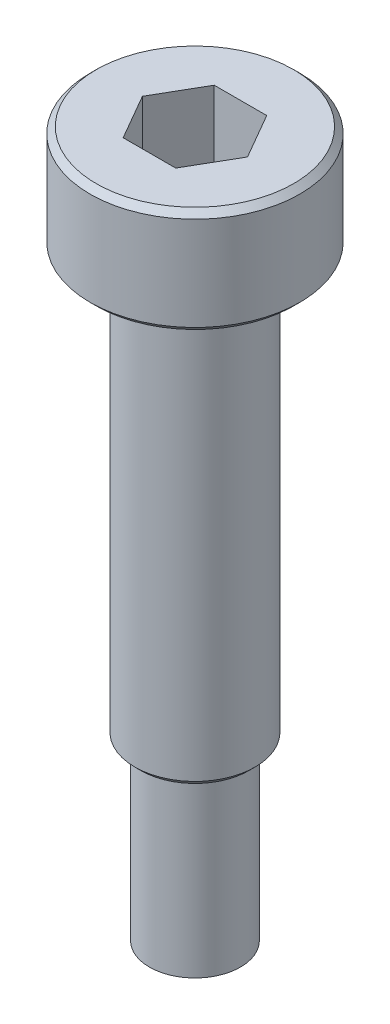
ISO-10303-21;
HEADER;
FILE_DESCRIPTION(('STEP AP214'),'2;1');
FILE_NAME('part.step','',(''),(''),'','','');
FILE_SCHEMA(('AUTOMOTIVE_DESIGN { 1 0 10303 214 1 1 1 1 }'));
ENDSEC;
DATA;
#1=APPLICATION_CONTEXT('core data for automotive mechanical design processes');
#2=APPLICATION_PROTOCOL_DEFINITION('international standard','automotive_design',2000,#1);
#3=PRODUCT_CONTEXT('',#1,'mechanical');
#4=PRODUCT('Part','Part','',(#3));
#5=PRODUCT_RELATED_PRODUCT_CATEGORY('part','',(#4));
#6=PRODUCT_DEFINITION_FORMATION('','',#4);
#7=PRODUCT_DEFINITION_CONTEXT('part definition',#1,'design');
#8=PRODUCT_DEFINITION('design','',#6,#7);
#9=PRODUCT_DEFINITION_SHAPE('','',#8);
#10=(LENGTH_UNIT() NAMED_UNIT(*) SI_UNIT(.MILLI.,.METRE.));
#11=(NAMED_UNIT(*) PLANE_ANGLE_UNIT() SI_UNIT($,.RADIAN.));
#12=(NAMED_UNIT(*) SI_UNIT($,.STERADIAN.) SOLID_ANGLE_UNIT());
#13=UNCERTAINTY_MEASURE_WITH_UNIT(LENGTH_MEASURE(1.E-05),#10,'distance_accuracy_value','');
#14=(GEOMETRIC_REPRESENTATION_CONTEXT(3) GLOBAL_UNCERTAINTY_ASSIGNED_CONTEXT((#13)) GLOBAL_UNIT_ASSIGNED_CONTEXT((#10,
#11,#12)) REPRESENTATION_CONTEXT('',''));
#15=CARTESIAN_POINT('',(0.,0.,0.));
#16=DIRECTION('',(0.,0.,1.));
#17=DIRECTION('',(1.,0.,0.));
#18=AXIS2_PLACEMENT_3D('',#15,#16,#17);
#19=CARTESIAN_POINT('',(0.,0.,0.));
#20=DIRECTION('',(0.,1.,0.));
#21=DIRECTION('',(0.,0.,1.));
#22=AXIS2_PLACEMENT_3D('',#19,#20,#21);
#23=PLANE('',#22);
#24=CARTESIAN_POINT('',(0.,0.,0.));
#25=DIRECTION('',(0.,1.,0.));
#26=DIRECTION('',(0.,0.,1.));
#27=AXIS2_PLACEMENT_3D('',#24,#25,#26);
#28=CIRCLE('',#27,1.5);
#29=CARTESIAN_POINT('',(0.,0.,1.5));
#30=VERTEX_POINT('',#29);
#31=EDGE_CURVE('E160',#30,#30,#28,.T.);
#32=ORIENTED_EDGE('',*,*,#31,.F.);
#33=EDGE_LOOP('',(#32));
#34=FACE_BOUND('',#33,.T.);
#35=ADVANCED_FACE('F46',(#34),#23,.F.);
#36=CARTESIAN_POINT('',(0.,23.24,0.));
#37=DIRECTION('',(0.,1.,0.));
#38=DIRECTION('',(0.,0.,1.));
#39=AXIS2_PLACEMENT_3D('',#36,#37,#38);
#40=CYLINDRICAL_SURFACE('',#39,1.5);
#41=CARTESIAN_POINT('',(0.,5.75,0.));
#42=DIRECTION('',(0.,1.,0.));
#43=DIRECTION('',(0.,0.,1.));
#44=AXIS2_PLACEMENT_3D('',#41,#42,#43);
#45=CIRCLE('',#44,1.5);
#46=CARTESIAN_POINT('',(0.,5.75,1.5));
#47=VERTEX_POINT('',#46);
#48=EDGE_CURVE('E157',#47,#47,#45,.T.);
#49=ORIENTED_EDGE('',*,*,#48,.F.);
#50=EDGE_LOOP('',(#49));
#51=FACE_BOUND('',#50,.T.);
#52=ORIENTED_EDGE('',*,*,#31,.T.);
#53=EDGE_LOOP('',(#52));
#54=FACE_BOUND('',#53,.T.);
#55=ADVANCED_FACE('F216',(#51,#54),#40,.T.);
#56=CARTESIAN_POINT('',(1.5,5.75,0.));
#57=DIRECTION('',(0.,1.,0.));
#58=DIRECTION('',(0.,0.,1.));
#59=AXIS2_PLACEMENT_3D('',#56,#57,#58);
#60=PLANE('',#59);
#61=CARTESIAN_POINT('',(0.,5.75,0.));
#62=DIRECTION('',(0.,1.,0.));
#63=DIRECTION('',(0.,0.,1.));
#64=AXIS2_PLACEMENT_3D('',#61,#62,#63);
#65=CIRCLE('',#64,1.77999999999999);
#66=CARTESIAN_POINT('',(0.,5.75,1.77999999999999));
#67=VERTEX_POINT('',#66);
#68=EDGE_CURVE('E166',#67,#67,#65,.F.);
#69=ORIENTED_EDGE('',*,*,#68,.T.);
#70=EDGE_LOOP('',(#69));
#71=FACE_BOUND('',#70,.T.);
#72=ORIENTED_EDGE('',*,*,#48,.T.);
#73=EDGE_LOOP('',(#72));
#74=FACE_BOUND('',#73,.T.);
#75=ADVANCED_FACE('F222',(#71,#74),#60,.F.);
#76=CARTESIAN_POINT('',(0.,23.24,0.));
#77=DIRECTION('',(0.,1.,0.));
#78=DIRECTION('',(0.,0.,1.));
#79=AXIS2_PLACEMENT_3D('',#76,#77,#78);
#80=CYLINDRICAL_SURFACE('',#79,1.98);
#81=CARTESIAN_POINT('',(0.,5.95000000000001,0.));
#82=DIRECTION('',(0.,1.,0.));
#83=DIRECTION('',(0.,0.,1.));
#84=AXIS2_PLACEMENT_3D('',#81,#82,#83);
#85=CIRCLE('',#84,1.98);
#86=CARTESIAN_POINT('',(0.,5.95000000000001,1.98));
#87=VERTEX_POINT('',#86);
#88=EDGE_CURVE('E163',#87,#87,#85,.T.);
#89=ORIENTED_EDGE('',*,*,#88,.T.);
#90=EDGE_LOOP('',(#89));
#91=FACE_BOUND('',#90,.T.);
#92=CARTESIAN_POINT('',(0.,19.75,0.));
#93=DIRECTION('',(0.,1.,0.));
#94=DIRECTION('',(0.,0.,1.));
#95=AXIS2_PLACEMENT_3D('',#92,#93,#94);
#96=CIRCLE('',#95,1.98);
#97=CARTESIAN_POINT('',(0.,19.75,1.98));
#98=VERTEX_POINT('',#97);
#99=EDGE_CURVE('E149',#98,#98,#96,.T.);
#100=ORIENTED_EDGE('',*,*,#99,.F.);
#101=EDGE_LOOP('',(#100));
#102=FACE_BOUND('',#101,.T.);
#103=ADVANCED_FACE('F246',(#91,#102),#80,.T.);
#104=CARTESIAN_POINT('',(1.98,19.75,0.));
#105=DIRECTION('',(0.,1.,0.));
#106=DIRECTION('',(0.,0.,1.));
#107=AXIS2_PLACEMENT_3D('',#104,#105,#106);
#108=PLANE('',#107);
#109=CARTESIAN_POINT('',(0.,19.75,0.));
#110=DIRECTION('',(0.,1.,0.));
#111=DIRECTION('',(0.,0.,1.));
#112=AXIS2_PLACEMENT_3D('',#109,#110,#111);
#113=CIRCLE('',#112,3.255);
#114=CARTESIAN_POINT('',(0.,19.75,3.255));
#115=VERTEX_POINT('',#114);
#116=EDGE_CURVE('E55',#115,#115,#113,.F.);
#117=ORIENTED_EDGE('',*,*,#116,.T.);
#118=EDGE_LOOP('',(#117));
#119=FACE_BOUND('',#118,.T.);
#120=ORIENTED_EDGE('',*,*,#99,.T.);
#121=EDGE_LOOP('',(#120));
#122=FACE_BOUND('',#121,.T.);
#123=ADVANCED_FACE('F177',(#119,#122),#108,.F.);
#124=CARTESIAN_POINT('',(0.,23.24,0.));
#125=DIRECTION('',(0.,1.,0.));
#126=DIRECTION('',(0.,0.,1.));
#127=AXIS2_PLACEMENT_3D('',#124,#125,#126);
#128=CYLINDRICAL_SURFACE('',#127,3.455);
#129=CARTESIAN_POINT('',(0.,19.95,0.));
#130=DIRECTION('',(0.,1.,0.));
#131=DIRECTION('',(0.,0.,1.));
#132=AXIS2_PLACEMENT_3D('',#129,#130,#131);
#133=CIRCLE('',#132,3.455);
#134=CARTESIAN_POINT('',(0.,19.95,3.455));
#135=VERTEX_POINT('',#134);
#136=EDGE_CURVE('E172',#135,#135,#133,.T.);
#137=ORIENTED_EDGE('',*,*,#136,.T.);
#138=EDGE_LOOP('',(#137));
#139=FACE_BOUND('',#138,.T.);
#140=CARTESIAN_POINT('',(0.,23.04,0.));
#141=DIRECTION('',(0.,-1.,0.));
#142=DIRECTION('',(0.,0.,-1.));
#143=AXIS2_PLACEMENT_3D('',#140,#141,#142);
#144=CIRCLE('',#143,3.455);
#145=CARTESIAN_POINT('',(0.,23.04,-3.455));
#146=VERTEX_POINT('',#145);
#147=EDGE_CURVE('E169',#146,#146,#144,.T.);
#148=ORIENTED_EDGE('',*,*,#147,.T.);
#149=EDGE_LOOP('',(#148));
#150=FACE_BOUND('',#149,.T.);
#151=ADVANCED_FACE('F186',(#139,#150),#128,.T.);
#152=CARTESIAN_POINT('',(3.455,23.24,0.));
#153=DIRECTION('',(0.,-1.,0.));
#154=DIRECTION('',(0.,0.,-1.));
#155=AXIS2_PLACEMENT_3D('',#152,#153,#154);
#156=PLANE('',#155);
#157=CARTESIAN_POINT('',(0.,23.24,0.));
#158=DIRECTION('',(0.,-1.,0.));
#159=DIRECTION('',(0.,0.,-1.));
#160=AXIS2_PLACEMENT_3D('',#157,#158,#159);
#161=CIRCLE('',#160,3.255);
#162=CARTESIAN_POINT('',(0.,23.24,-3.255));
#163=VERTEX_POINT('',#162);
#164=EDGE_CURVE('E11',#163,#163,#161,.F.);
#165=ORIENTED_EDGE('',*,*,#164,.T.);
#166=EDGE_LOOP('',(#165));
#167=FACE_BOUND('',#166,.T.);
#168=DIRECTION('',(-0.5,0.,-0.866025403784439));
#169=VECTOR('',#168,1.);
#170=CARTESIAN_POINT('',(1.73205080756888,23.24,0.));
#171=LINE('',#170,#169);
#172=CARTESIAN_POINT('',(1.73205080756888,23.24,0.));
#173=VERTEX_POINT('',#172);
#174=CARTESIAN_POINT('',(0.866025403784438,23.24,-1.5));
#175=VERTEX_POINT('',#174);
#176=EDGE_CURVE('E136',#173,#175,#171,.T.);
#177=ORIENTED_EDGE('',*,*,#176,.F.);
#178=DIRECTION('',(0.5,0.,-0.866025403784439));
#179=VECTOR('',#178,1.);
#180=CARTESIAN_POINT('',(0.86602540378444,23.24,1.5));
#181=LINE('',#180,#179);
#182=CARTESIAN_POINT('',(0.86602540378444,23.24,1.5));
#183=VERTEX_POINT('',#182);
#184=EDGE_CURVE('E62',#183,#173,#181,.T.);
#185=ORIENTED_EDGE('',*,*,#184,.F.);
#186=DIRECTION('',(1.,0.,0.));
#187=VECTOR('',#186,1.);
#188=CARTESIAN_POINT('',(-0.866025403784438,23.24,1.5));
#189=LINE('',#188,#187);
#190=CARTESIAN_POINT('',(-0.866025403784438,23.24,1.5));
#191=VERTEX_POINT('',#190);
#192=EDGE_CURVE('E145',#191,#183,#189,.T.);
#193=ORIENTED_EDGE('',*,*,#192,.F.);
#194=DIRECTION('',(0.5,0.,0.866025403784438));
#195=VECTOR('',#194,1.);
#196=CARTESIAN_POINT('',(-1.73205080756888,23.24,0.));
#197=LINE('',#196,#195);
#198=CARTESIAN_POINT('',(-1.73205080756888,23.24,0.));
#199=VERTEX_POINT('',#198);
#200=EDGE_CURVE('E143',#199,#191,#197,.T.);
#201=ORIENTED_EDGE('',*,*,#200,.F.);
#202=DIRECTION('',(-0.5,0.,0.866025403784439));
#203=VECTOR('',#202,1.);
#204=CARTESIAN_POINT('',(-0.866025403784439,23.24,-1.5));
#205=LINE('',#204,#203);
#206=CARTESIAN_POINT('',(-0.866025403784439,23.24,-1.5));
#207=VERTEX_POINT('',#206);
#208=EDGE_CURVE('E110',#207,#199,#205,.T.);
#209=ORIENTED_EDGE('',*,*,#208,.F.);
#210=DIRECTION('',(-1.,0.,0.));
#211=VECTOR('',#210,1.);
#212=CARTESIAN_POINT('',(0.866025403784438,23.24,-1.5));
#213=LINE('',#212,#211);
#214=EDGE_CURVE('E139',#175,#207,#213,.T.);
#215=ORIENTED_EDGE('',*,*,#214,.F.);
#216=EDGE_LOOP('',(#177,#185,#193,#201,#209,#215));
#217=FACE_BOUND('',#216,.T.);
#218=ADVANCED_FACE('F189',(#167,#217),#156,.F.);
#219=CARTESIAN_POINT('',(0.86602540378444,20.84,1.5));
#220=DIRECTION('',(0.866025403784439,0.,0.5));
#221=DIRECTION('',(0.5,0.,-0.866025403784439));
#222=AXIS2_PLACEMENT_3D('',#219,#220,#221);
#223=PLANE('',#222);
#224=ORIENTED_EDGE('',*,*,#184,.T.);
#225=DIRECTION('',(0.,1.,0.));
#226=VECTOR('',#225,1.);
#227=CARTESIAN_POINT('',(1.73205080756888,20.84,0.));
#228=LINE('',#227,#226);
#229=CARTESIAN_POINT('',(1.73205080756888,20.84,0.));
#230=VERTEX_POINT('',#229);
#231=EDGE_CURVE('E92',#230,#173,#228,.T.);
#232=ORIENTED_EDGE('',*,*,#231,.F.);
#233=DIRECTION('',(0.5,0.,-0.866025403784439));
#234=VECTOR('',#233,1.);
#235=CARTESIAN_POINT('',(0.86602540378444,20.84,1.5));
#236=LINE('',#235,#234);
#237=CARTESIAN_POINT('',(0.86602540378444,20.84,1.5));
#238=VERTEX_POINT('',#237);
#239=EDGE_CURVE('E147',#238,#230,#236,.T.);
#240=ORIENTED_EDGE('',*,*,#239,.F.);
#241=DIRECTION('',(0.,1.,0.));
#242=VECTOR('',#241,1.);
#243=CARTESIAN_POINT('',(0.86602540378444,20.84,1.5));
#244=LINE('',#243,#242);
#245=EDGE_CURVE('E70',#238,#183,#244,.T.);
#246=ORIENTED_EDGE('',*,*,#245,.T.);
#247=EDGE_LOOP('',(#224,#232,#240,#246));
#248=FACE_BOUND('',#247,.T.);
#249=ADVANCED_FACE('F199',(#248),#223,.F.);
#250=CARTESIAN_POINT('',(-0.866025403784438,20.84,1.5));
#251=DIRECTION('',(0.,0.,1.));
#252=DIRECTION('',(1.,0.,0.));
#253=AXIS2_PLACEMENT_3D('',#250,#251,#252);
#254=PLANE('',#253);
#255=ORIENTED_EDGE('',*,*,#192,.T.);
#256=ORIENTED_EDGE('',*,*,#245,.F.);
#257=DIRECTION('',(1.,0.,0.));
#258=VECTOR('',#257,1.);
#259=CARTESIAN_POINT('',(-0.866025403784438,20.84,1.5));
#260=LINE('',#259,#258);
#261=CARTESIAN_POINT('',(-0.866025403784438,20.84,1.5));
#262=VERTEX_POINT('',#261);
#263=EDGE_CURVE('E122',#262,#238,#260,.T.);
#264=ORIENTED_EDGE('',*,*,#263,.F.);
#265=DIRECTION('',(0.,1.,0.));
#266=VECTOR('',#265,1.);
#267=CARTESIAN_POINT('',(-0.866025403784438,20.84,1.5));
#268=LINE('',#267,#266);
#269=EDGE_CURVE('E114',#262,#191,#268,.T.);
#270=ORIENTED_EDGE('',*,*,#269,.T.);
#271=EDGE_LOOP('',(#255,#256,#264,#270));
#272=FACE_BOUND('',#271,.T.);
#273=ADVANCED_FACE('F208',(#272),#254,.F.);
#274=CARTESIAN_POINT('',(-1.73205080756888,20.84,0.));
#275=DIRECTION('',(-0.866025403784439,0.,0.5));
#276=DIRECTION('',(0.5,0.,0.866025403784439));
#277=AXIS2_PLACEMENT_3D('',#274,#275,#276);
#278=PLANE('',#277);
#279=ORIENTED_EDGE('',*,*,#200,.T.);
#280=ORIENTED_EDGE('',*,*,#269,.F.);
#281=DIRECTION('',(0.5,0.,0.866025403784438));
#282=VECTOR('',#281,1.);
#283=CARTESIAN_POINT('',(-1.73205080756888,20.84,0.));
#284=LINE('',#283,#282);
#285=CARTESIAN_POINT('',(-1.73205080756888,20.84,0.));
#286=VERTEX_POINT('',#285);
#287=EDGE_CURVE('E118',#286,#262,#284,.T.);
#288=ORIENTED_EDGE('',*,*,#287,.F.);
#289=DIRECTION('',(0.,1.,0.));
#290=VECTOR('',#289,1.);
#291=CARTESIAN_POINT('',(-1.73205080756888,20.84,0.));
#292=LINE('',#291,#290);
#293=EDGE_CURVE('E103',#286,#199,#292,.T.);
#294=ORIENTED_EDGE('',*,*,#293,.T.);
#295=EDGE_LOOP('',(#279,#280,#288,#294));
#296=FACE_BOUND('',#295,.T.);
#297=ADVANCED_FACE('F119',(#296),#278,.F.);
#298=CARTESIAN_POINT('',(-0.866025403784439,20.84,-1.5));
#299=DIRECTION('',(-0.866025403784439,0.,-0.5));
#300=DIRECTION('',(-0.5,0.,0.866025403784439));
#301=AXIS2_PLACEMENT_3D('',#298,#299,#300);
#302=PLANE('',#301);
#303=ORIENTED_EDGE('',*,*,#208,.T.);
#304=ORIENTED_EDGE('',*,*,#293,.F.);
#305=DIRECTION('',(-0.5,0.,0.866025403784439));
#306=VECTOR('',#305,1.);
#307=CARTESIAN_POINT('',(-0.866025403784439,20.84,-1.5));
#308=LINE('',#307,#306);
#309=CARTESIAN_POINT('',(-0.866025403784439,20.84,-1.5));
#310=VERTEX_POINT('',#309);
#311=EDGE_CURVE('E107',#310,#286,#308,.T.);
#312=ORIENTED_EDGE('',*,*,#311,.F.);
#313=DIRECTION('',(0.,1.,0.));
#314=VECTOR('',#313,1.);
#315=CARTESIAN_POINT('',(-0.866025403784439,20.84,-1.5));
#316=LINE('',#315,#314);
#317=EDGE_CURVE('E115',#310,#207,#316,.T.);
#318=ORIENTED_EDGE('',*,*,#317,.T.);
#319=EDGE_LOOP('',(#303,#304,#312,#318));
#320=FACE_BOUND('',#319,.T.);
#321=ADVANCED_FACE('F105',(#320),#302,.F.);
#322=CARTESIAN_POINT('',(0.866025403784438,20.84,-1.5));
#323=DIRECTION('',(0.,0.,-1.));
#324=DIRECTION('',(-1.,0.,0.));
#325=AXIS2_PLACEMENT_3D('',#322,#323,#324);
#326=PLANE('',#325);
#327=ORIENTED_EDGE('',*,*,#214,.T.);
#328=ORIENTED_EDGE('',*,*,#317,.F.);
#329=DIRECTION('',(-1.,0.,0.));
#330=VECTOR('',#329,1.);
#331=CARTESIAN_POINT('',(0.866025403784438,20.84,-1.5));
#332=LINE('',#331,#330);
#333=CARTESIAN_POINT('',(0.866025403784438,20.84,-1.5));
#334=VERTEX_POINT('',#333);
#335=EDGE_CURVE('E128',#334,#310,#332,.T.);
#336=ORIENTED_EDGE('',*,*,#335,.F.);
#337=DIRECTION('',(0.,1.,0.));
#338=VECTOR('',#337,1.);
#339=CARTESIAN_POINT('',(0.866025403784438,20.84,-1.5));
#340=LINE('',#339,#338);
#341=EDGE_CURVE('E152',#334,#175,#340,.T.);
#342=ORIENTED_EDGE('',*,*,#341,.T.);
#343=EDGE_LOOP('',(#327,#328,#336,#342));
#344=FACE_BOUND('',#343,.T.);
#345=ADVANCED_FACE('F313',(#344),#326,.F.);
#346=CARTESIAN_POINT('',(1.73205080756888,20.84,0.));
#347=DIRECTION('',(0.866025403784438,0.,-0.5));
#348=DIRECTION('',(-0.5,0.,-0.866025403784439));
#349=AXIS2_PLACEMENT_3D('',#346,#347,#348);
#350=PLANE('',#349);
#351=ORIENTED_EDGE('',*,*,#176,.T.);
#352=ORIENTED_EDGE('',*,*,#341,.F.);
#353=DIRECTION('',(-0.5,0.,-0.866025403784439));
#354=VECTOR('',#353,1.);
#355=CARTESIAN_POINT('',(1.73205080756888,20.84,0.));
#356=LINE('',#355,#354);
#357=EDGE_CURVE('E130',#230,#334,#356,.T.);
#358=ORIENTED_EDGE('',*,*,#357,.F.);
#359=ORIENTED_EDGE('',*,*,#231,.T.);
#360=EDGE_LOOP('',(#351,#352,#358,#359));
#361=FACE_BOUND('',#360,.T.);
#362=ADVANCED_FACE('F205',(#361),#350,.F.);
#363=CARTESIAN_POINT('',(0.,20.84,0.));
#364=DIRECTION('',(0.,1.,0.));
#365=DIRECTION('',(0.,0.,1.));
#366=AXIS2_PLACEMENT_3D('',#363,#364,#365);
#367=PLANE('',#366);
#368=ORIENTED_EDGE('',*,*,#239,.T.);
#369=ORIENTED_EDGE('',*,*,#357,.T.);
#370=ORIENTED_EDGE('',*,*,#335,.T.);
#371=ORIENTED_EDGE('',*,*,#311,.T.);
#372=ORIENTED_EDGE('',*,*,#287,.T.);
#373=ORIENTED_EDGE('',*,*,#263,.T.);
#374=EDGE_LOOP('',(#368,#369,#370,#371,#372,#373));
#375=FACE_BOUND('',#374,.T.);
#376=ADVANCED_FACE('F125',(#375),#367,.T.);
#377=CARTESIAN_POINT('',(0.,5.95000000000001,0.));
#378=DIRECTION('',(0.,1.,0.));
#379=DIRECTION('',(0.,0.,1.));
#380=AXIS2_PLACEMENT_3D('',#377,#378,#379);
#381=CONICAL_SURFACE('',#380,1.98,0.785398163397456);
#382=ORIENTED_EDGE('',*,*,#68,.F.);
#383=EDGE_LOOP('',(#382));
#384=FACE_BOUND('',#383,.T.);
#385=ORIENTED_EDGE('',*,*,#88,.F.);
#386=EDGE_LOOP('',(#385));
#387=FACE_BOUND('',#386,.T.);
#388=ADVANCED_FACE('F183',(#384,#387),#381,.T.);
#389=CARTESIAN_POINT('',(0.,19.95,0.));
#390=DIRECTION('',(0.,1.,0.));
#391=DIRECTION('',(0.,0.,1.));
#392=AXIS2_PLACEMENT_3D('',#389,#390,#391);
#393=CONICAL_SURFACE('',#392,3.455,0.78539816339745);
#394=ORIENTED_EDGE('',*,*,#116,.F.);
#395=EDGE_LOOP('',(#394));
#396=FACE_BOUND('',#395,.T.);
#397=ORIENTED_EDGE('',*,*,#136,.F.);
#398=EDGE_LOOP('',(#397));
#399=FACE_BOUND('',#398,.T.);
#400=ADVANCED_FACE('F180',(#396,#399),#393,.T.);
#401=CARTESIAN_POINT('',(0.,23.24,0.));
#402=DIRECTION('',(0.,-1.,0.));
#403=DIRECTION('',(0.,0.,-1.));
#404=AXIS2_PLACEMENT_3D('',#401,#402,#403);
#405=CONICAL_SURFACE('',#404,3.255,0.785398163397442);
#406=ORIENTED_EDGE('',*,*,#147,.F.);
#407=EDGE_LOOP('',(#406));
#408=FACE_BOUND('',#407,.T.);
#409=ORIENTED_EDGE('',*,*,#164,.F.);
#410=EDGE_LOOP('',(#409));
#411=FACE_BOUND('',#410,.T.);
#412=ADVANCED_FACE('F49',(#408,#411),#405,.T.);
#413=CLOSED_SHELL('',(#35,#55,#75,#103,#123,#151,#218,#249,#273,#297,#321,#345,#362,#376,#388,
#400,#412));
#414=MANIFOLD_SOLID_BREP('B2',#413);
#415=ADVANCED_BREP_SHAPE_REPRESENTATION('',(#18,#414),#14);
#416=SHAPE_DEFINITION_REPRESENTATION(#9,#415);
ENDSEC;
END-ISO-10303-21;
